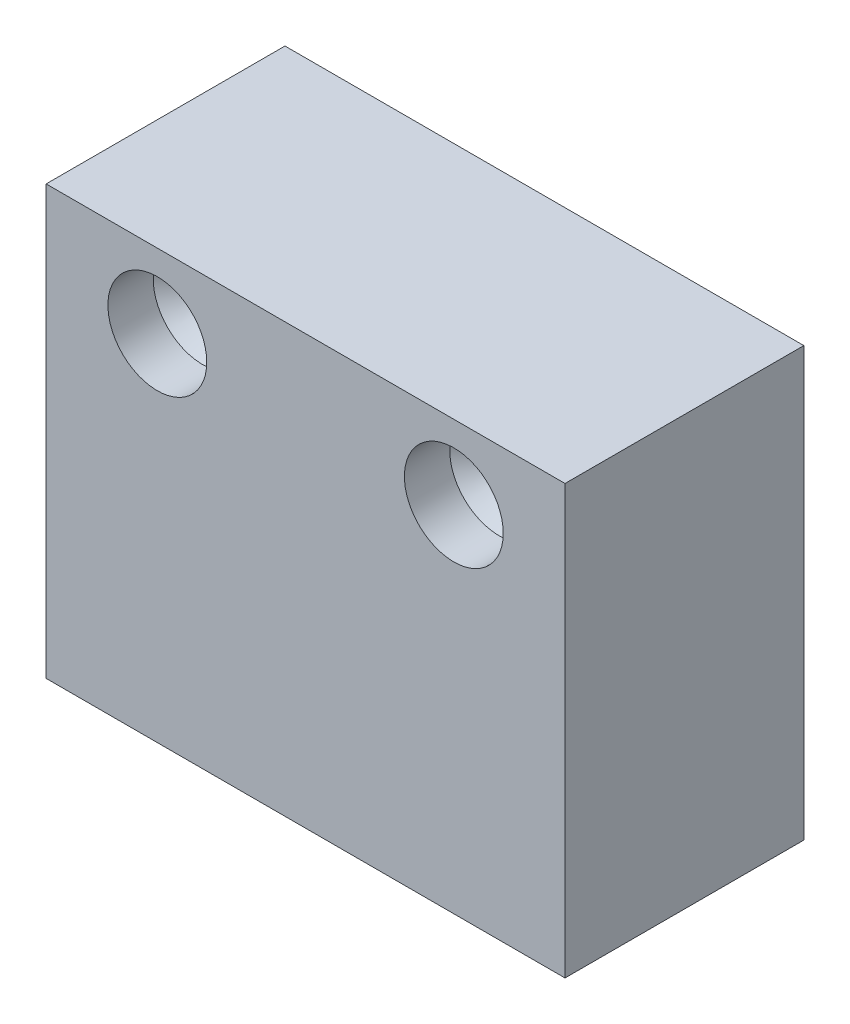
ISO-10303-21;
HEADER;
FILE_DESCRIPTION(('STEP AP214'),'2;1');
FILE_NAME('part.step','',(''),(''),'','','');
FILE_SCHEMA(('AUTOMOTIVE_DESIGN { 1 0 10303 214 1 1 1 1 }'));
ENDSEC;
DATA;
#1=APPLICATION_CONTEXT('core data for automotive mechanical design processes');
#2=APPLICATION_PROTOCOL_DEFINITION('international standard','automotive_design',2000,#1);
#3=PRODUCT_CONTEXT('',#1,'mechanical');
#4=PRODUCT('Part','Part','',(#3));
#5=PRODUCT_RELATED_PRODUCT_CATEGORY('part','',(#4));
#6=PRODUCT_DEFINITION_FORMATION('','',#4);
#7=PRODUCT_DEFINITION_CONTEXT('part definition',#1,'design');
#8=PRODUCT_DEFINITION('design','',#6,#7);
#9=PRODUCT_DEFINITION_SHAPE('','',#8);
#10=(LENGTH_UNIT() NAMED_UNIT(*) SI_UNIT(.MILLI.,.METRE.));
#11=(NAMED_UNIT(*) PLANE_ANGLE_UNIT() SI_UNIT($,.RADIAN.));
#12=(NAMED_UNIT(*) SI_UNIT($,.STERADIAN.) SOLID_ANGLE_UNIT());
#13=UNCERTAINTY_MEASURE_WITH_UNIT(LENGTH_MEASURE(1.E-05),#10,'distance_accuracy_value','');
#14=(GEOMETRIC_REPRESENTATION_CONTEXT(3) GLOBAL_UNCERTAINTY_ASSIGNED_CONTEXT((#13)) GLOBAL_UNIT_ASSIGNED_CONTEXT((#10,
#11,#12)) REPRESENTATION_CONTEXT('',''));
#15=CARTESIAN_POINT('',(0.,0.,0.));
#16=DIRECTION('',(0.,0.,1.));
#17=DIRECTION('',(1.,0.,0.));
#18=AXIS2_PLACEMENT_3D('',#15,#16,#17);
#19=CARTESIAN_POINT('',(42.1182761916576,-30.2295725482066,632.300025939941));
#20=DIRECTION('',(0.577350269189633,0.577350269189633,-0.577350269189612));
#21=DIRECTION('',(-0.707106781186535,0.,-0.70710678118656));
#22=AXIS2_PLACEMENT_3D('',#19,#20,#21);
#23=PLANE('',#22);
#24=DIRECTION('',(-0.707106781186548,0.707106781186548,0.));
#25=VECTOR('',#24,1.);
#26=CARTESIAN_POINT('',(42.8682761916576,-30.2295725482066,633.050025939941));
#27=LINE('',#26,#25);
#28=CARTESIAN_POINT('',(42.8682761916576,-30.2295725482066,633.050025939941));
#29=VERTEX_POINT('',#28);
#30=CARTESIAN_POINT('',(42.1182761916576,-29.4795725482066,633.050025939941));
#31=VERTEX_POINT('',#30);
#32=EDGE_CURVE('E34',#29,#31,#27,.T.);
#33=ORIENTED_EDGE('',*,*,#32,.F.);
#34=DIRECTION('',(0.707106781186535,0.,0.70710678118656));
#35=VECTOR('',#34,1.);
#36=CARTESIAN_POINT('',(42.1182761916576,-30.2295725482066,632.300025939941));
#37=LINE('',#36,#35);
#38=CARTESIAN_POINT('',(42.1182761916576,-30.2295725482066,632.300025939941));
#39=VERTEX_POINT('',#38);
#40=EDGE_CURVE('E318',#39,#29,#37,.T.);
#41=ORIENTED_EDGE('',*,*,#40,.F.);
#42=DIRECTION('',(0.,-0.707106781186535,-0.70710678118656));
#43=VECTOR('',#42,1.);
#44=CARTESIAN_POINT('',(42.1182761916576,-29.4795725482066,633.050025939941));
#45=LINE('',#44,#43);
#46=EDGE_CURVE('E263',#31,#39,#45,.T.);
#47=ORIENTED_EDGE('',*,*,#46,.F.);
#48=EDGE_LOOP('',(#33,#41,#47));
#49=FACE_BOUND('',#48,.T.);
#50=ADVANCED_FACE('F15',(#49),#23,.T.);
#51=CARTESIAN_POINT('',(42.8682761916576,-38.7295725482066,633.050025939941));
#52=DIRECTION('',(0.577350269189633,-0.577350269189633,-0.577350269189612));
#53=DIRECTION('',(-0.707106781186535,0.,-0.70710678118656));
#54=AXIS2_PLACEMENT_3D('',#51,#52,#53);
#55=PLANE('',#54);
#56=DIRECTION('',(0.,-0.707106781186535,0.70710678118656));
#57=VECTOR('',#56,1.);
#58=CARTESIAN_POINT('',(42.1182761916576,-38.7295725482066,632.300025939941));
#59=LINE('',#58,#57);
#60=CARTESIAN_POINT('',(42.1182761916576,-38.7295725482066,632.300025939941));
#61=VERTEX_POINT('',#60);
#62=CARTESIAN_POINT('',(42.1182761916576,-39.4795725482066,633.050025939941));
#63=VERTEX_POINT('',#62);
#64=EDGE_CURVE('E293',#61,#63,#59,.T.);
#65=ORIENTED_EDGE('',*,*,#64,.F.);
#66=DIRECTION('',(-0.707106781186535,0.,-0.70710678118656));
#67=VECTOR('',#66,1.);
#68=CARTESIAN_POINT('',(42.8682761916576,-38.7295725482066,633.050025939941));
#69=LINE('',#68,#67);
#70=CARTESIAN_POINT('',(42.8682761916576,-38.7295725482066,633.050025939941));
#71=VERTEX_POINT('',#70);
#72=EDGE_CURVE('E10',#71,#61,#69,.T.);
#73=ORIENTED_EDGE('',*,*,#72,.F.);
#74=DIRECTION('',(0.707106781186548,0.707106781186548,0.));
#75=VECTOR('',#74,1.);
#76=CARTESIAN_POINT('',(42.1182761916576,-39.4795725482066,633.050025939941));
#77=LINE('',#76,#75);
#78=EDGE_CURVE('E308',#63,#71,#77,.T.);
#79=ORIENTED_EDGE('',*,*,#78,.F.);
#80=EDGE_LOOP('',(#65,#73,#79));
#81=FACE_BOUND('',#80,.T.);
#82=ADVANCED_FACE('F378',(#81),#55,.T.);
#83=CARTESIAN_POINT('',(42.4932761916577,-34.4795725482066,632.675025939941));
#84=DIRECTION('',(0.70710678118656,0.,-0.707106781186535));
#85=DIRECTION('',(-0.707106781186535,0.,-0.70710678118656));
#86=AXIS2_PLACEMENT_3D('',#83,#84,#85);
#87=PLANE('',#86);
#88=ORIENTED_EDGE('',*,*,#72,.T.);
#89=DIRECTION('',(0.,1.,0.));
#90=VECTOR('',#89,1.);
#91=CARTESIAN_POINT('',(42.1182761916576,-34.4795725482066,632.300025939941));
#92=LINE('',#91,#90);
#93=EDGE_CURVE('E25',#61,#39,#92,.T.);
#94=ORIENTED_EDGE('',*,*,#93,.T.);
#95=ORIENTED_EDGE('',*,*,#40,.T.);
#96=DIRECTION('',(0.,-1.,0.));
#97=VECTOR('',#96,1.);
#98=CARTESIAN_POINT('',(42.8682761916576,-34.4795725482066,633.050025939941));
#99=LINE('',#98,#97);
#100=EDGE_CURVE('E315',#29,#71,#99,.T.);
#101=ORIENTED_EDGE('',*,*,#100,.T.);
#102=EDGE_LOOP('',(#88,#94,#95,#101));
#103=FACE_BOUND('',#102,.T.);
#104=ADVANCED_FACE('F349',(#103),#87,.T.);
#105=CARTESIAN_POINT('',(42.4932761916577,-39.1045725482066,633.550025939941));
#106=DIRECTION('',(0.707106781186548,-0.707106781186548,0.));
#107=DIRECTION('',(0.,0.,-1.));
#108=AXIS2_PLACEMENT_3D('',#105,#106,#107);
#109=PLANE('',#108);
#110=DIRECTION('',(-0.707106781186548,-0.707106781186548,0.));
#111=VECTOR('',#110,1.);
#112=CARTESIAN_POINT('',(45.180782301873,-36.4170664379913,634.80000782013));
#113=LINE('',#112,#111);
#114=CARTESIAN_POINT('',(42.8682761916576,-38.7295725482066,634.80000782013));
#115=VERTEX_POINT('',#114);
#116=CARTESIAN_POINT('',(42.1182761916576,-39.4795725482066,634.80000782013));
#117=VERTEX_POINT('',#116);
#118=EDGE_CURVE('E312',#115,#117,#113,.T.);
#119=ORIENTED_EDGE('',*,*,#118,.T.);
#120=DIRECTION('',(0.,0.,-1.));
#121=VECTOR('',#120,1.);
#122=CARTESIAN_POINT('',(42.1182761916576,-39.4795725482066,633.550025939941));
#123=LINE('',#122,#121);
#124=EDGE_CURVE('E309',#117,#63,#123,.T.);
#125=ORIENTED_EDGE('',*,*,#124,.T.);
#126=ORIENTED_EDGE('',*,*,#78,.T.);
#127=DIRECTION('',(0.,0.,1.));
#128=VECTOR('',#127,1.);
#129=CARTESIAN_POINT('',(42.8682761916576,-38.7295725482066,633.550025939941));
#130=LINE('',#129,#128);
#131=EDGE_CURVE('E301',#71,#115,#130,.T.);
#132=ORIENTED_EDGE('',*,*,#131,.T.);
#133=EDGE_LOOP('',(#119,#125,#126,#132));
#134=FACE_BOUND('',#133,.T.);
#135=ADVANCED_FACE('F388',(#134),#109,.T.);
#136=CARTESIAN_POINT('',(39.3682761916577,-30.2295725482066,633.050025939941));
#137=DIRECTION('',(-0.577350269189635,0.577350269189635,-0.577350269189608));
#138=DIRECTION('',(-0.70710678118653,0.,0.707106781186565));
#139=AXIS2_PLACEMENT_3D('',#136,#137,#138);
#140=PLANE('',#139);
#141=DIRECTION('',(0.,0.707106781186535,0.70710678118656));
#142=VECTOR('',#141,1.);
#143=CARTESIAN_POINT('',(40.1182761916576,-30.2295725482066,632.300025939941));
#144=LINE('',#143,#142);
#145=CARTESIAN_POINT('',(40.1182761916576,-30.2295725482066,632.300025939941));
#146=VERTEX_POINT('',#145);
#147=CARTESIAN_POINT('',(40.1182761916577,-29.4795725482066,633.050025939941));
#148=VERTEX_POINT('',#147);
#149=EDGE_CURVE('E259',#146,#148,#144,.T.);
#150=ORIENTED_EDGE('',*,*,#149,.F.);
#151=DIRECTION('',(0.707106781186531,0.,-0.707106781186564));
#152=VECTOR('',#151,1.);
#153=CARTESIAN_POINT('',(39.3682761916577,-30.2295725482066,633.050025939941));
#154=LINE('',#153,#152);
#155=CARTESIAN_POINT('',(39.3682761916577,-30.2295725482066,633.050025939941));
#156=VERTEX_POINT('',#155);
#157=EDGE_CURVE('E280',#156,#146,#154,.T.);
#158=ORIENTED_EDGE('',*,*,#157,.F.);
#159=DIRECTION('',(-0.707106781186548,-0.707106781186548,0.));
#160=VECTOR('',#159,1.);
#161=CARTESIAN_POINT('',(40.1182761916577,-29.4795725482066,633.050025939941));
#162=LINE('',#161,#160);
#163=EDGE_CURVE('E266',#148,#156,#162,.T.);
#164=ORIENTED_EDGE('',*,*,#163,.F.);
#165=EDGE_LOOP('',(#150,#158,#164));
#166=FACE_BOUND('',#165,.T.);
#167=ADVANCED_FACE('F362',(#166),#140,.T.);
#168=CARTESIAN_POINT('',(40.1182761916577,-39.4795725482066,633.050025939941));
#169=DIRECTION('',(-0.577350269189635,-0.577350269189635,-0.577350269189607));
#170=DIRECTION('',(-0.70710678118653,0.,0.707106781186565));
#171=AXIS2_PLACEMENT_3D('',#168,#169,#170);
#172=PLANE('',#171);
#173=DIRECTION('',(-0.707106781186531,0.,0.707106781186564));
#174=VECTOR('',#173,1.);
#175=CARTESIAN_POINT('',(40.1182761916576,-38.7295725482066,632.300025939941));
#176=LINE('',#175,#174);
#177=CARTESIAN_POINT('',(40.1182761916576,-38.7295725482066,632.300025939941));
#178=VERTEX_POINT('',#177);
#179=CARTESIAN_POINT('',(39.3682761916577,-38.7295725482066,633.050025939941));
#180=VERTEX_POINT('',#179);
#181=EDGE_CURVE('E276',#178,#180,#176,.T.);
#182=ORIENTED_EDGE('',*,*,#181,.F.);
#183=DIRECTION('',(0.,0.707106781186535,-0.70710678118656));
#184=VECTOR('',#183,1.);
#185=CARTESIAN_POINT('',(40.1182761916577,-39.4795725482066,633.050025939941));
#186=LINE('',#185,#184);
#187=CARTESIAN_POINT('',(40.1182761916577,-39.4795725482066,633.050025939941));
#188=VERTEX_POINT('',#187);
#189=EDGE_CURVE('E297',#188,#178,#186,.T.);
#190=ORIENTED_EDGE('',*,*,#189,.F.);
#191=DIRECTION('',(0.707106781186548,-0.707106781186548,0.));
#192=VECTOR('',#191,1.);
#193=CARTESIAN_POINT('',(39.3682761916577,-38.7295725482066,633.050025939941));
#194=LINE('',#193,#192);
#195=EDGE_CURVE('E283',#180,#188,#194,.T.);
#196=ORIENTED_EDGE('',*,*,#195,.F.);
#197=EDGE_LOOP('',(#182,#190,#196));
#198=FACE_BOUND('',#197,.T.);
#199=ADVANCED_FACE('F394',(#198),#172,.T.);
#200=CARTESIAN_POINT('',(41.1182761916576,-39.1045725482066,632.675025939941));
#201=DIRECTION('',(0.,-0.70710678118656,-0.707106781186535));
#202=DIRECTION('',(-1.,0.,0.));
#203=AXIS2_PLACEMENT_3D('',#200,#201,#202);
#204=PLANE('',#203);
#205=ORIENTED_EDGE('',*,*,#189,.T.);
#206=DIRECTION('',(1.,0.,0.));
#207=VECTOR('',#206,1.);
#208=CARTESIAN_POINT('',(41.1182761916576,-38.7295725482066,632.300025939941));
#209=LINE('',#208,#207);
#210=EDGE_CURVE('E294',#178,#61,#209,.T.);
#211=ORIENTED_EDGE('',*,*,#210,.T.);
#212=ORIENTED_EDGE('',*,*,#64,.T.);
#213=DIRECTION('',(-1.,0.,0.));
#214=VECTOR('',#213,1.);
#215=CARTESIAN_POINT('',(41.1182761916576,-39.4795725482066,633.050025939941));
#216=LINE('',#215,#214);
#217=EDGE_CURVE('E290',#63,#188,#216,.T.);
#218=ORIENTED_EDGE('',*,*,#217,.T.);
#219=EDGE_LOOP('',(#205,#211,#212,#218));
#220=FACE_BOUND('',#219,.T.);
#221=ADVANCED_FACE('F397',(#220),#204,.T.);
#222=CARTESIAN_POINT('',(39.7432761916577,-39.1045725482066,633.550025939941));
#223=DIRECTION('',(-0.707106781186548,-0.707106781186548,0.));
#224=DIRECTION('',(0.,0.,1.));
#225=AXIS2_PLACEMENT_3D('',#222,#223,#224);
#226=PLANE('',#225);
#227=DIRECTION('',(-0.707106781186548,0.707106781186548,0.));
#228=VECTOR('',#227,1.);
#229=CARTESIAN_POINT('',(40.805782301873,-40.1670786584219,634.80000782013));
#230=LINE('',#229,#228);
#231=CARTESIAN_POINT('',(40.1182761916577,-39.4795725482066,634.80000782013));
#232=VERTEX_POINT('',#231);
#233=CARTESIAN_POINT('',(39.3682761916577,-38.7295725482066,634.80000782013));
#234=VERTEX_POINT('',#233);
#235=EDGE_CURVE('E287',#232,#234,#230,.T.);
#236=ORIENTED_EDGE('',*,*,#235,.T.);
#237=DIRECTION('',(0.,0.,-1.));
#238=VECTOR('',#237,1.);
#239=CARTESIAN_POINT('',(39.3682761916577,-38.7295725482066,633.550025939941));
#240=LINE('',#239,#238);
#241=EDGE_CURVE('E284',#234,#180,#240,.T.);
#242=ORIENTED_EDGE('',*,*,#241,.T.);
#243=ORIENTED_EDGE('',*,*,#195,.T.);
#244=DIRECTION('',(0.,0.,1.));
#245=VECTOR('',#244,1.);
#246=CARTESIAN_POINT('',(40.1182761916577,-39.4795725482066,633.550025939941));
#247=LINE('',#246,#245);
#248=EDGE_CURVE('E281',#188,#232,#247,.T.);
#249=ORIENTED_EDGE('',*,*,#248,.T.);
#250=EDGE_LOOP('',(#236,#242,#243,#249));
#251=FACE_BOUND('',#250,.T.);
#252=ADVANCED_FACE('F375',(#251),#226,.T.);
#253=CARTESIAN_POINT('',(39.7432761916576,-34.4795725482066,632.675025939941));
#254=DIRECTION('',(-0.707106781186564,0.,-0.707106781186531));
#255=DIRECTION('',(-0.707106781186531,0.,0.707106781186564));
#256=AXIS2_PLACEMENT_3D('',#253,#254,#255);
#257=PLANE('',#256);
#258=ORIENTED_EDGE('',*,*,#157,.T.);
#259=DIRECTION('',(0.,-1.,0.));
#260=VECTOR('',#259,1.);
#261=CARTESIAN_POINT('',(40.1182761916576,-34.4795725482066,632.300025939941));
#262=LINE('',#261,#260);
#263=EDGE_CURVE('E277',#146,#178,#262,.T.);
#264=ORIENTED_EDGE('',*,*,#263,.T.);
#265=ORIENTED_EDGE('',*,*,#181,.T.);
#266=DIRECTION('',(0.,1.,0.));
#267=VECTOR('',#266,1.);
#268=CARTESIAN_POINT('',(39.3682761916577,-34.4795725482066,633.050025939941));
#269=LINE('',#268,#267);
#270=EDGE_CURVE('E273',#180,#156,#269,.T.);
#271=ORIENTED_EDGE('',*,*,#270,.T.);
#272=EDGE_LOOP('',(#258,#264,#265,#271));
#273=FACE_BOUND('',#272,.T.);
#274=ADVANCED_FACE('F358',(#273),#257,.T.);
#275=CARTESIAN_POINT('',(39.7432761916577,-29.8545725482066,633.550025939941));
#276=DIRECTION('',(-0.707106781186548,0.707106781186548,0.));
#277=DIRECTION('',(0.,0.,1.));
#278=AXIS2_PLACEMENT_3D('',#275,#276,#277);
#279=PLANE('',#278);
#280=DIRECTION('',(0.707106781186548,0.707106781186548,0.));
#281=VECTOR('',#280,1.);
#282=CARTESIAN_POINT('',(40.805782301873,-28.7920664379913,634.80000782013));
#283=LINE('',#282,#281);
#284=CARTESIAN_POINT('',(39.3682761916577,-30.2295725482066,634.80000782013));
#285=VERTEX_POINT('',#284);
#286=CARTESIAN_POINT('',(40.1182761916577,-29.4795725482066,634.80000782013));
#287=VERTEX_POINT('',#286);
#288=EDGE_CURVE('E270',#285,#287,#283,.T.);
#289=ORIENTED_EDGE('',*,*,#288,.T.);
#290=DIRECTION('',(0.,0.,-1.));
#291=VECTOR('',#290,1.);
#292=CARTESIAN_POINT('',(40.1182761916577,-29.4795725482066,633.550025939941));
#293=LINE('',#292,#291);
#294=EDGE_CURVE('E267',#287,#148,#293,.T.);
#295=ORIENTED_EDGE('',*,*,#294,.T.);
#296=ORIENTED_EDGE('',*,*,#163,.T.);
#297=DIRECTION('',(0.,0.,1.));
#298=VECTOR('',#297,1.);
#299=CARTESIAN_POINT('',(39.3682761916577,-30.2295725482066,633.550025939941));
#300=LINE('',#299,#298);
#301=EDGE_CURVE('E264',#156,#285,#300,.T.);
#302=ORIENTED_EDGE('',*,*,#301,.T.);
#303=EDGE_LOOP('',(#289,#295,#296,#302));
#304=FACE_BOUND('',#303,.T.);
#305=ADVANCED_FACE('F366',(#304),#279,.T.);
#306=CARTESIAN_POINT('',(41.1182761916576,-29.8545725482066,632.675025939941));
#307=DIRECTION('',(0.,0.70710678118656,-0.707106781186535));
#308=DIRECTION('',(-1.,0.,0.));
#309=AXIS2_PLACEMENT_3D('',#306,#307,#308);
#310=PLANE('',#309);
#311=ORIENTED_EDGE('',*,*,#46,.T.);
#312=DIRECTION('',(-1.,0.,0.));
#313=VECTOR('',#312,1.);
#314=CARTESIAN_POINT('',(41.1182761916576,-30.2295725482066,632.300025939941));
#315=LINE('',#314,#313);
#316=EDGE_CURVE('E260',#39,#146,#315,.T.);
#317=ORIENTED_EDGE('',*,*,#316,.T.);
#318=ORIENTED_EDGE('',*,*,#149,.T.);
#319=DIRECTION('',(1.,0.,0.));
#320=VECTOR('',#319,1.);
#321=CARTESIAN_POINT('',(41.1182761916576,-29.4795725482066,633.050025939941));
#322=LINE('',#321,#320);
#323=EDGE_CURVE('E256',#148,#31,#322,.T.);
#324=ORIENTED_EDGE('',*,*,#323,.T.);
#325=EDGE_LOOP('',(#311,#317,#318,#324));
#326=FACE_BOUND('',#325,.T.);
#327=ADVANCED_FACE('F332',(#326),#310,.T.);
#328=CARTESIAN_POINT('',(42.4932761916577,-29.8545725482066,633.550025939941));
#329=DIRECTION('',(0.707106781186548,0.707106781186548,0.));
#330=DIRECTION('',(0.,0.,-1.));
#331=AXIS2_PLACEMENT_3D('',#328,#329,#330);
#332=PLANE('',#331);
#333=DIRECTION('',(0.707106781186548,-0.707106781186548,0.));
#334=VECTOR('',#333,1.);
#335=CARTESIAN_POINT('',(45.180782301873,-32.5420786584219,634.80000782013));
#336=LINE('',#335,#334);
#337=CARTESIAN_POINT('',(42.1182761916576,-29.4795725482066,634.80000782013));
#338=VERTEX_POINT('',#337);
#339=CARTESIAN_POINT('',(42.8682761916576,-30.2295725482066,634.80000782013));
#340=VERTEX_POINT('',#339);
#341=EDGE_CURVE('E253',#338,#340,#336,.T.);
#342=ORIENTED_EDGE('',*,*,#341,.T.);
#343=DIRECTION('',(0.,0.,-1.));
#344=VECTOR('',#343,1.);
#345=CARTESIAN_POINT('',(42.8682761916576,-30.2295725482066,633.550025939941));
#346=LINE('',#345,#344);
#347=EDGE_CURVE('E250',#340,#29,#346,.T.);
#348=ORIENTED_EDGE('',*,*,#347,.T.);
#349=ORIENTED_EDGE('',*,*,#32,.T.);
#350=DIRECTION('',(0.,0.,1.));
#351=VECTOR('',#350,1.);
#352=CARTESIAN_POINT('',(42.1182761916576,-29.4795725482066,633.550025939941));
#353=LINE('',#352,#351);
#354=EDGE_CURVE('E235',#31,#338,#353,.T.);
#355=ORIENTED_EDGE('',*,*,#354,.T.);
#356=EDGE_LOOP('',(#342,#348,#349,#355));
#357=FACE_BOUND('',#356,.T.);
#358=ADVANCED_FACE('F327',(#357),#332,.T.);
#359=CARTESIAN_POINT('',(41.1182761916576,-39.4795725482066,633.550025939941));
#360=DIRECTION('',(0.,1.,0.));
#361=DIRECTION('',(0.,0.,1.));
#362=AXIS2_PLACEMENT_3D('',#359,#360,#361);
#363=PLANE('',#362);
#364=ORIENTED_EDGE('',*,*,#248,.F.);
#365=ORIENTED_EDGE('',*,*,#217,.F.);
#366=ORIENTED_EDGE('',*,*,#124,.F.);
#367=DIRECTION('',(1.,0.,0.));
#368=VECTOR('',#367,1.);
#369=CARTESIAN_POINT('',(44.8682884120883,-39.4795725482066,634.80000782013));
#370=LINE('',#369,#368);
#371=EDGE_CURVE('E244',#232,#117,#370,.T.);
#372=ORIENTED_EDGE('',*,*,#371,.F.);
#373=EDGE_LOOP('',(#364,#365,#366,#372));
#374=FACE_BOUND('',#373,.T.);
#375=ADVANCED_FACE('F410',(#374),#363,.F.);
#376=CARTESIAN_POINT('',(42.8682761916576,-34.4795725482066,633.550025939941));
#377=DIRECTION('',(-1.,0.,0.));
#378=DIRECTION('',(0.,0.,-1.));
#379=AXIS2_PLACEMENT_3D('',#376,#377,#378);
#380=PLANE('',#379);
#381=ORIENTED_EDGE('',*,*,#131,.F.);
#382=ORIENTED_EDGE('',*,*,#100,.F.);
#383=ORIENTED_EDGE('',*,*,#347,.F.);
#384=DIRECTION('',(0.,1.,0.));
#385=VECTOR('',#384,1.);
#386=CARTESIAN_POINT('',(42.8682761916576,-34.4795725482066,634.80000782013));
#387=LINE('',#386,#385);
#388=EDGE_CURVE('E212',#115,#340,#387,.T.);
#389=ORIENTED_EDGE('',*,*,#388,.F.);
#390=EDGE_LOOP('',(#381,#382,#383,#389));
#391=FACE_BOUND('',#390,.T.);
#392=ADVANCED_FACE('F346',(#391),#380,.F.);
#393=CARTESIAN_POINT('',(41.1182761916576,-34.4795725482066,632.300025939941));
#394=DIRECTION('',(0.,0.,-1.));
#395=DIRECTION('',(1.,0.,0.));
#396=AXIS2_PLACEMENT_3D('',#393,#394,#395);
#397=PLANE('',#396);
#398=ORIENTED_EDGE('',*,*,#93,.F.);
#399=ORIENTED_EDGE('',*,*,#210,.F.);
#400=ORIENTED_EDGE('',*,*,#263,.F.);
#401=ORIENTED_EDGE('',*,*,#316,.F.);
#402=EDGE_LOOP('',(#398,#399,#400,#401));
#403=FACE_BOUND('',#402,.T.);
#404=ADVANCED_FACE('F355',(#403),#397,.T.);
#405=CARTESIAN_POINT('',(39.3682761916577,-34.4795725482066,633.550025939941));
#406=DIRECTION('',(1.,0.,0.));
#407=DIRECTION('',(0.,0.,1.));
#408=AXIS2_PLACEMENT_3D('',#405,#406,#407);
#409=PLANE('',#408);
#410=ORIENTED_EDGE('',*,*,#241,.F.);
#411=DIRECTION('',(0.,-1.,0.));
#412=VECTOR('',#411,1.);
#413=CARTESIAN_POINT('',(39.3682761916577,-34.4795725482066,634.80000782013));
#414=LINE('',#413,#412);
#415=EDGE_CURVE('E241',#285,#234,#414,.T.);
#416=ORIENTED_EDGE('',*,*,#415,.F.);
#417=ORIENTED_EDGE('',*,*,#301,.F.);
#418=ORIENTED_EDGE('',*,*,#270,.F.);
#419=EDGE_LOOP('',(#410,#416,#417,#418));
#420=FACE_BOUND('',#419,.T.);
#421=ADVANCED_FACE('F364',(#420),#409,.F.);
#422=CARTESIAN_POINT('',(41.1182761916576,-29.4795725482066,633.550025939941));
#423=DIRECTION('',(0.,-1.,0.));
#424=DIRECTION('',(0.,0.,-1.));
#425=AXIS2_PLACEMENT_3D('',#422,#423,#424);
#426=PLANE('',#425);
#427=ORIENTED_EDGE('',*,*,#294,.F.);
#428=DIRECTION('',(-1.,0.,0.));
#429=VECTOR('',#428,1.);
#430=CARTESIAN_POINT('',(44.8682884120883,-29.4795725482066,634.80000782013));
#431=LINE('',#430,#429);
#432=EDGE_CURVE('E238',#338,#287,#431,.T.);
#433=ORIENTED_EDGE('',*,*,#432,.F.);
#434=ORIENTED_EDGE('',*,*,#354,.F.);
#435=ORIENTED_EDGE('',*,*,#323,.F.);
#436=EDGE_LOOP('',(#427,#433,#434,#435));
#437=FACE_BOUND('',#436,.T.);
#438=ADVANCED_FACE('F336',(#437),#426,.F.);
#439=CARTESIAN_POINT('',(45.368283821052,-22.9795725482065,636.425015449524));
#440=DIRECTION('',(0.,0.,1.));
#441=DIRECTION('',(1.,0.,0.));
#442=AXIS2_PLACEMENT_3D('',#439,#440,#441);
#443=CONICAL_SURFACE('',#442,2.375,0.785398163397448);
#444=CARTESIAN_POINT('',(45.368283821052,-22.9795725482066,635.800015449524));
#445=DIRECTION('',(0.,0.,1.));
#446=DIRECTION('',(0.,-1.,0.));
#447=AXIS2_PLACEMENT_3D('',#444,#445,#446);
#448=CIRCLE('',#447,1.75);
#449=CARTESIAN_POINT('',(45.368283821052,-24.7295725482066,635.800015449524));
#450=VERTEX_POINT('',#449);
#451=EDGE_CURVE('E230',#450,#450,#448,.T.);
#452=ORIENTED_EDGE('',*,*,#451,.F.);
#453=EDGE_LOOP('',(#452));
#454=FACE_BOUND('',#453,.T.);
#455=CARTESIAN_POINT('',(45.368283821052,-22.9795725482065,637.050015449524));
#456=DIRECTION('',(0.,0.,1.));
#457=DIRECTION('',(1.,0.,0.));
#458=AXIS2_PLACEMENT_3D('',#455,#456,#457);
#459=CIRCLE('',#458,3.);
#460=CARTESIAN_POINT('',(48.368283821052,-22.9795725482065,637.050015449524));
#461=VERTEX_POINT('',#460);
#462=EDGE_CURVE('E226',#461,#461,#459,.T.);
#463=ORIENTED_EDGE('',*,*,#462,.T.);
#464=EDGE_LOOP('',(#463));
#465=FACE_BOUND('',#464,.T.);
#466=ADVANCED_FACE('F430',(#454,#465),#443,.F.);
#467=CARTESIAN_POINT('',(45.368283821052,-22.9795725482065,651.800033569336));
#468=DIRECTION('',(0.,0.,-1.));
#469=DIRECTION('',(1.,0.,0.));
#470=AXIS2_PLACEMENT_3D('',#467,#468,#469);
#471=CYLINDRICAL_SURFACE('',#470,3.);
#472=CARTESIAN_POINT('',(45.368283821052,-22.9795725482065,639.800000190735));
#473=DIRECTION('',(0.,0.,-1.));
#474=DIRECTION('',(1.,0.,0.));
#475=AXIS2_PLACEMENT_3D('',#472,#473,#474);
#476=CIRCLE('',#475,3.);
#477=CARTESIAN_POINT('',(48.368283821052,-22.9795725482065,639.800000190735));
#478=VERTEX_POINT('',#477);
#479=EDGE_CURVE('E191',#478,#478,#476,.T.);
#480=ORIENTED_EDGE('',*,*,#479,.F.);
#481=EDGE_LOOP('',(#480));
#482=FACE_BOUND('',#481,.T.);
#483=ORIENTED_EDGE('',*,*,#462,.F.);
#484=EDGE_LOOP('',(#483));
#485=FACE_BOUND('',#484,.T.);
#486=ADVANCED_FACE('F433',(#482,#485),#471,.F.);
#487=CARTESIAN_POINT('',(63.3682838210521,-22.9795725482066,636.425000190735));
#488=DIRECTION('',(0.,0.,1.));
#489=DIRECTION('',(1.,0.,0.));
#490=AXIS2_PLACEMENT_3D('',#487,#488,#489);
#491=CONICAL_SURFACE('',#490,2.375,0.785398163397448);
#492=CARTESIAN_POINT('',(63.3682838210521,-22.9795725482066,635.800000190735));
#493=DIRECTION('',(0.,0.,1.));
#494=DIRECTION('',(0.,-1.,0.));
#495=AXIS2_PLACEMENT_3D('',#492,#493,#494);
#496=CIRCLE('',#495,1.75);
#497=CARTESIAN_POINT('',(63.3682838210521,-24.7295725482066,635.800000190735));
#498=VERTEX_POINT('',#497);
#499=EDGE_CURVE('E227',#498,#498,#496,.T.);
#500=ORIENTED_EDGE('',*,*,#499,.F.);
#501=EDGE_LOOP('',(#500));
#502=FACE_BOUND('',#501,.T.);
#503=CARTESIAN_POINT('',(63.3682838210521,-22.9795725482066,637.050000190735));
#504=DIRECTION('',(0.,0.,1.));
#505=DIRECTION('',(1.,0.,0.));
#506=AXIS2_PLACEMENT_3D('',#503,#504,#505);
#507=CIRCLE('',#506,3.);
#508=CARTESIAN_POINT('',(66.3682838210521,-22.9795725482066,637.050000190735));
#509=VERTEX_POINT('',#508);
#510=EDGE_CURVE('E223',#509,#509,#507,.T.);
#511=ORIENTED_EDGE('',*,*,#510,.T.);
#512=EDGE_LOOP('',(#511));
#513=FACE_BOUND('',#512,.T.);
#514=ADVANCED_FACE('F437',(#502,#513),#491,.F.);
#515=CARTESIAN_POINT('',(63.3682838210521,-22.9795725482066,651.800018310547));
#516=DIRECTION('',(0.,0.,1.));
#517=DIRECTION('',(1.,0.,0.));
#518=AXIS2_PLACEMENT_3D('',#515,#516,#517);
#519=CYLINDRICAL_SURFACE('',#518,3.);
#520=CARTESIAN_POINT('',(63.3682838210521,-22.9795725482066,639.800000190735));
#521=DIRECTION('',(0.,0.,-1.));
#522=DIRECTION('',(1.,0.,0.));
#523=AXIS2_PLACEMENT_3D('',#520,#521,#522);
#524=CIRCLE('',#523,3.);
#525=CARTESIAN_POINT('',(66.3682838210521,-22.9795725482066,639.800000190735));
#526=VERTEX_POINT('',#525);
#527=EDGE_CURVE('E168',#526,#526,#524,.T.);
#528=ORIENTED_EDGE('',*,*,#527,.F.);
#529=EDGE_LOOP('',(#528));
#530=FACE_BOUND('',#529,.T.);
#531=ORIENTED_EDGE('',*,*,#510,.F.);
#532=EDGE_LOOP('',(#531));
#533=FACE_BOUND('',#532,.T.);
#534=ADVANCED_FACE('F441',(#530,#533),#519,.F.);
#535=CARTESIAN_POINT('',(63.3682838210521,-22.9795725482066,632.800000190735));
#536=DIRECTION('',(0.,0.,1.));
#537=DIRECTION('',(0.,-1.,0.));
#538=AXIS2_PLACEMENT_3D('',#535,#536,#537);
#539=CYLINDRICAL_SURFACE('',#538,1.75);
#540=ORIENTED_EDGE('',*,*,#499,.T.);
#541=EDGE_LOOP('',(#540));
#542=FACE_BOUND('',#541,.T.);
#543=CARTESIAN_POINT('',(63.3682838210521,-22.9795725482066,625.300000190735));
#544=DIRECTION('',(0.,0.,1.));
#545=DIRECTION('',(0.,-1.,0.));
#546=AXIS2_PLACEMENT_3D('',#543,#544,#545);
#547=CIRCLE('',#546,1.75);
#548=CARTESIAN_POINT('',(63.3682838210521,-24.7295725482066,625.300000190735));
#549=VERTEX_POINT('',#548);
#550=EDGE_CURVE('E184',#549,#549,#547,.T.);
#551=ORIENTED_EDGE('',*,*,#550,.F.);
#552=EDGE_LOOP('',(#551));
#553=FACE_BOUND('',#552,.T.);
#554=ADVANCED_FACE('F445',(#542,#553),#539,.F.);
#555=CARTESIAN_POINT('',(45.368283821052,-22.9795725482066,632.800000190735));
#556=DIRECTION('',(0.,0.,1.));
#557=DIRECTION('',(0.,-1.,0.));
#558=AXIS2_PLACEMENT_3D('',#555,#556,#557);
#559=CYLINDRICAL_SURFACE('',#558,1.75);
#560=ORIENTED_EDGE('',*,*,#451,.T.);
#561=EDGE_LOOP('',(#560));
#562=FACE_BOUND('',#561,.T.);
#563=CARTESIAN_POINT('',(45.368283821052,-22.9795725482066,625.300000190735));
#564=DIRECTION('',(0.,0.,1.));
#565=DIRECTION('',(0.,-1.,0.));
#566=AXIS2_PLACEMENT_3D('',#563,#564,#565);
#567=CIRCLE('',#566,1.75);
#568=CARTESIAN_POINT('',(45.368283821052,-24.7295725482066,625.300000190735));
#569=VERTEX_POINT('',#568);
#570=EDGE_CURVE('E198',#569,#569,#567,.T.);
#571=ORIENTED_EDGE('',*,*,#570,.F.);
#572=EDGE_LOOP('',(#571));
#573=FACE_BOUND('',#572,.T.);
#574=ADVANCED_FACE('F449',(#562,#573),#559,.F.);
#575=CARTESIAN_POINT('',(48.6183006325189,-34.4795725482065,634.80000782013));
#576=DIRECTION('',(0.,0.,1.));
#577=DIRECTION('',(0.,1.,0.));
#578=AXIS2_PLACEMENT_3D('',#575,#576,#577);
#579=PLANE('',#578);
#580=ORIENTED_EDGE('',*,*,#432,.T.);
#581=ORIENTED_EDGE('',*,*,#288,.F.);
#582=ORIENTED_EDGE('',*,*,#415,.T.);
#583=ORIENTED_EDGE('',*,*,#235,.F.);
#584=ORIENTED_EDGE('',*,*,#371,.T.);
#585=ORIENTED_EDGE('',*,*,#118,.F.);
#586=ORIENTED_EDGE('',*,*,#388,.T.);
#587=ORIENTED_EDGE('',*,*,#341,.F.);
#588=EDGE_LOOP('',(#580,#581,#582,#583,#584,#585,#586,#587));
#589=FACE_BOUND('',#588,.T.);
#590=DIRECTION('',(0.,-1.,0.));
#591=VECTOR('',#590,1.);
#592=CARTESIAN_POINT('',(38.6182761916576,-34.4795725482066,634.80000782013));
#593=LINE('',#592,#591);
#594=CARTESIAN_POINT('',(38.6182761916576,-26.4795725482065,634.80000782013));
#595=VERTEX_POINT('',#594);
#596=CARTESIAN_POINT('',(38.6182761916576,-42.4795725482066,634.80000782013));
#597=VERTEX_POINT('',#596);
#598=EDGE_CURVE('E201',#595,#597,#593,.T.);
#599=ORIENTED_EDGE('',*,*,#598,.F.);
#600=DIRECTION('',(-1.,0.,0.));
#601=VECTOR('',#600,1.);
#602=CARTESIAN_POINT('',(51.1183006325189,-26.4795725482065,634.80000782013));
#603=LINE('',#602,#601);
#604=CARTESIAN_POINT('',(68.618300632519,-26.4795725482065,634.80000782013));
#605=VERTEX_POINT('',#604);
#606=EDGE_CURVE('E207',#605,#595,#603,.T.);
#607=ORIENTED_EDGE('',*,*,#606,.F.);
#608=DIRECTION('',(0.,1.,0.));
#609=VECTOR('',#608,1.);
#610=CARTESIAN_POINT('',(68.618300632519,-34.4795725482065,634.80000782013));
#611=LINE('',#610,#609);
#612=CARTESIAN_POINT('',(68.618300632519,-42.4795725482066,634.80000782013));
#613=VERTEX_POINT('',#612);
#614=EDGE_CURVE('E195',#613,#605,#611,.T.);
#615=ORIENTED_EDGE('',*,*,#614,.F.);
#616=DIRECTION('',(1.,0.,0.));
#617=VECTOR('',#616,1.);
#618=CARTESIAN_POINT('',(51.1183006325189,-42.4795725482066,634.80000782013));
#619=LINE('',#618,#617);
#620=EDGE_CURVE('E206',#597,#613,#619,.T.);
#621=ORIENTED_EDGE('',*,*,#620,.F.);
#622=EDGE_LOOP('',(#599,#607,#615,#621));
#623=FACE_BOUND('',#622,.T.);
#624=ADVANCED_FACE('F339',(#589,#623),#579,.F.);
#625=CARTESIAN_POINT('',(53.618300632519,-42.4795725482066,629.300000190735));
#626=DIRECTION('',(0.,1.,0.));
#627=DIRECTION('',(0.,0.,-1.));
#628=AXIS2_PLACEMENT_3D('',#625,#626,#627);
#629=PLANE('',#628);
#630=DIRECTION('',(0.,0.,-1.));
#631=VECTOR('',#630,1.);
#632=CARTESIAN_POINT('',(38.6182761916576,-42.4795725482066,631.050000190735));
#633=LINE('',#632,#631);
#634=CARTESIAN_POINT('',(38.6182761916578,-42.4795725482066,625.300000190735));
#635=VERTEX_POINT('',#634);
#636=EDGE_CURVE('E183',#597,#635,#633,.T.);
#637=ORIENTED_EDGE('',*,*,#636,.F.);
#638=ORIENTED_EDGE('',*,*,#620,.T.);
#639=DIRECTION('',(0.,0.,-1.));
#640=VECTOR('',#639,1.);
#641=CARTESIAN_POINT('',(68.618300632519,-42.4795725482066,629.300000190735));
#642=LINE('',#641,#640);
#643=CARTESIAN_POINT('',(68.6183006325191,-42.4795725482066,625.300000190735));
#644=VERTEX_POINT('',#643);
#645=EDGE_CURVE('E203',#613,#644,#642,.T.);
#646=ORIENTED_EDGE('',*,*,#645,.T.);
#647=DIRECTION('',(1.,0.,0.));
#648=VECTOR('',#647,1.);
#649=CARTESIAN_POINT('',(51.9406722927035,-42.4795725482066,625.300000190735));
#650=LINE('',#649,#648);
#651=EDGE_CURVE('E187',#635,#644,#650,.T.);
#652=ORIENTED_EDGE('',*,*,#651,.F.);
#653=EDGE_LOOP('',(#637,#638,#646,#652));
#654=FACE_BOUND('',#653,.T.);
#655=ADVANCED_FACE('F456',(#654),#629,.T.);
#656=CARTESIAN_POINT('',(53.618300632519,-26.4795725482065,629.300000190735));
#657=DIRECTION('',(0.,-1.,0.));
#658=DIRECTION('',(0.,0.,1.));
#659=AXIS2_PLACEMENT_3D('',#656,#657,#658);
#660=PLANE('',#659);
#661=DIRECTION('',(0.,0.,1.));
#662=VECTOR('',#661,1.);
#663=CARTESIAN_POINT('',(38.6182761916576,-26.4795725482065,631.050000190735));
#664=LINE('',#663,#662);
#665=CARTESIAN_POINT('',(38.6182761916578,-26.4795725482065,625.300000190735));
#666=VERTEX_POINT('',#665);
#667=EDGE_CURVE('E196',#666,#595,#664,.T.);
#668=ORIENTED_EDGE('',*,*,#667,.F.);
#669=DIRECTION('',(-1.,0.,0.));
#670=VECTOR('',#669,1.);
#671=CARTESIAN_POINT('',(51.9406722927035,-26.4795725482065,625.300000190735));
#672=LINE('',#671,#670);
#673=CARTESIAN_POINT('',(68.6183006325191,-26.4795725482065,625.300000190735));
#674=VERTEX_POINT('',#673);
#675=EDGE_CURVE('E178',#674,#666,#672,.T.);
#676=ORIENTED_EDGE('',*,*,#675,.F.);
#677=DIRECTION('',(0.,0.,-1.));
#678=VECTOR('',#677,1.);
#679=CARTESIAN_POINT('',(68.618300632519,-26.4795725482065,629.300000190735));
#680=LINE('',#679,#678);
#681=EDGE_CURVE('E192',#605,#674,#680,.T.);
#682=ORIENTED_EDGE('',*,*,#681,.F.);
#683=ORIENTED_EDGE('',*,*,#606,.T.);
#684=EDGE_LOOP('',(#668,#676,#682,#683));
#685=FACE_BOUND('',#684,.T.);
#686=ADVANCED_FACE('F459',(#685),#660,.T.);
#687=CARTESIAN_POINT('',(68.618300632519,-34.4795725482065,629.300000190735));
#688=DIRECTION('',(-1.,0.,0.));
#689=DIRECTION('',(0.,0.,-1.));
#690=AXIS2_PLACEMENT_3D('',#687,#688,#689);
#691=PLANE('',#690);
#692=ORIENTED_EDGE('',*,*,#645,.F.);
#693=ORIENTED_EDGE('',*,*,#614,.T.);
#694=ORIENTED_EDGE('',*,*,#681,.T.);
#695=DIRECTION('',(0.,1.,0.));
#696=VECTOR('',#695,1.);
#697=CARTESIAN_POINT('',(68.6183006325191,-34.4795725482065,625.300000190735));
#698=LINE('',#697,#696);
#699=EDGE_CURVE('E188',#644,#674,#698,.T.);
#700=ORIENTED_EDGE('',*,*,#699,.F.);
#701=EDGE_LOOP('',(#692,#693,#694,#700));
#702=FACE_BOUND('',#701,.T.);
#703=ADVANCED_FACE('F463',(#702),#691,.T.);
#704=CARTESIAN_POINT('',(38.6182761916576,-34.4795725482066,632.800000190735));
#705=DIRECTION('',(1.,0.,0.));
#706=DIRECTION('',(0.,0.,1.));
#707=AXIS2_PLACEMENT_3D('',#704,#705,#706);
#708=PLANE('',#707);
#709=ORIENTED_EDGE('',*,*,#667,.T.);
#710=ORIENTED_EDGE('',*,*,#598,.T.);
#711=ORIENTED_EDGE('',*,*,#636,.T.);
#712=DIRECTION('',(0.,1.,0.));
#713=VECTOR('',#712,1.);
#714=CARTESIAN_POINT('',(38.6182761916578,-34.4795725482066,625.300000190735));
#715=LINE('',#714,#713);
#716=CARTESIAN_POINT('',(38.6182761916578,-44.4795725482066,625.300000190735));
#717=VERTEX_POINT('',#716);
#718=EDGE_CURVE('E172',#717,#635,#715,.T.);
#719=ORIENTED_EDGE('',*,*,#718,.F.);
#720=DIRECTION('',(0.,0.,1.));
#721=VECTOR('',#720,1.);
#722=CARTESIAN_POINT('',(38.6182761916576,-44.4795725482066,632.800000190735));
#723=LINE('',#722,#721);
#724=CARTESIAN_POINT('',(38.6182761916576,-44.4795725482066,639.800000190735));
#725=VERTEX_POINT('',#724);
#726=EDGE_CURVE('E180',#717,#725,#723,.T.);
#727=ORIENTED_EDGE('',*,*,#726,.T.);
#728=DIRECTION('',(0.,-1.,0.));
#729=VECTOR('',#728,1.);
#730=CARTESIAN_POINT('',(38.6182761916576,-34.4795725482066,639.800000190735));
#731=LINE('',#730,#729);
#732=CARTESIAN_POINT('',(38.6182761916576,-18.4795725482065,639.800000190735));
#733=VERTEX_POINT('',#732);
#734=EDGE_CURVE('E152',#733,#725,#731,.T.);
#735=ORIENTED_EDGE('',*,*,#734,.F.);
#736=DIRECTION('',(0.,0.,1.));
#737=VECTOR('',#736,1.);
#738=CARTESIAN_POINT('',(38.6182761916576,-18.4795725482065,632.800000190735));
#739=LINE('',#738,#737);
#740=CARTESIAN_POINT('',(38.6182761916578,-18.4795725482065,625.300000190735));
#741=VERTEX_POINT('',#740);
#742=EDGE_CURVE('E149',#741,#733,#739,.T.);
#743=ORIENTED_EDGE('',*,*,#742,.F.);
#744=DIRECTION('',(0.,1.,0.));
#745=VECTOR('',#744,1.);
#746=CARTESIAN_POINT('',(38.6182761916578,-34.4795725482066,625.300000190735));
#747=LINE('',#746,#745);
#748=EDGE_CURVE('E176',#666,#741,#747,.T.);
#749=ORIENTED_EDGE('',*,*,#748,.F.);
#750=EDGE_LOOP('',(#709,#710,#711,#719,#727,#735,#743,#749));
#751=FACE_BOUND('',#750,.T.);
#752=ADVANCED_FACE('F467',(#751),#708,.F.);
#753=CARTESIAN_POINT('',(50.263043952888,-34.4795725482066,625.300000190735));
#754=DIRECTION('',(0.,0.,-1.));
#755=DIRECTION('',(0.,-1.,0.));
#756=AXIS2_PLACEMENT_3D('',#753,#754,#755);
#757=PLANE('',#756);
#758=ORIENTED_EDGE('',*,*,#550,.T.);
#759=EDGE_LOOP('',(#758));
#760=FACE_BOUND('',#759,.T.);
#761=ORIENTED_EDGE('',*,*,#570,.T.);
#762=EDGE_LOOP('',(#761));
#763=FACE_BOUND('',#762,.T.);
#764=ORIENTED_EDGE('',*,*,#675,.T.);
#765=ORIENTED_EDGE('',*,*,#748,.T.);
#766=DIRECTION('',(1.,0.,0.));
#767=VECTOR('',#766,1.);
#768=CARTESIAN_POINT('',(50.263043952888,-18.4795725482065,625.300000190735));
#769=LINE('',#768,#767);
#770=CARTESIAN_POINT('',(70.1182914504466,-18.4795725482065,625.300000190735));
#771=VERTEX_POINT('',#770);
#772=EDGE_CURVE('E174',#741,#771,#769,.T.);
#773=ORIENTED_EDGE('',*,*,#772,.T.);
#774=DIRECTION('',(0.,-1.,0.));
#775=VECTOR('',#774,1.);
#776=CARTESIAN_POINT('',(70.1182914504466,-34.4795725482065,625.300000190735));
#777=LINE('',#776,#775);
#778=CARTESIAN_POINT('',(70.1182914504466,-44.4795725482065,625.300000190735));
#779=VERTEX_POINT('',#778);
#780=EDGE_CURVE('E161',#771,#779,#777,.T.);
#781=ORIENTED_EDGE('',*,*,#780,.T.);
#782=DIRECTION('',(-1.,0.,0.));
#783=VECTOR('',#782,1.);
#784=CARTESIAN_POINT('',(50.263043952888,-44.4795725482066,625.300000190735));
#785=LINE('',#784,#783);
#786=EDGE_CURVE('E169',#779,#717,#785,.T.);
#787=ORIENTED_EDGE('',*,*,#786,.T.);
#788=ORIENTED_EDGE('',*,*,#718,.T.);
#789=ORIENTED_EDGE('',*,*,#651,.T.);
#790=ORIENTED_EDGE('',*,*,#699,.T.);
#791=EDGE_LOOP('',(#764,#765,#773,#781,#787,#788,#789,#790));
#792=FACE_BOUND('',#791,.T.);
#793=ADVANCED_FACE('F471',(#760,#763,#792),#757,.T.);
#794=CARTESIAN_POINT('',(50.263043952888,-34.4795725482066,639.800000190735));
#795=DIRECTION('',(0.,0.,-1.));
#796=DIRECTION('',(0.,-1.,0.));
#797=AXIS2_PLACEMENT_3D('',#794,#795,#796);
#798=PLANE('',#797);
#799=ORIENTED_EDGE('',*,*,#479,.T.);
#800=EDGE_LOOP('',(#799));
#801=FACE_BOUND('',#800,.T.);
#802=ORIENTED_EDGE('',*,*,#527,.T.);
#803=EDGE_LOOP('',(#802));
#804=FACE_BOUND('',#803,.T.);
#805=DIRECTION('',(1.,0.,0.));
#806=VECTOR('',#805,1.);
#807=CARTESIAN_POINT('',(50.263043952888,-44.4795725482066,639.800000190735));
#808=LINE('',#807,#806);
#809=CARTESIAN_POINT('',(70.1182914504466,-44.4795725482065,639.800000190735));
#810=VERTEX_POINT('',#809);
#811=EDGE_CURVE('E156',#725,#810,#808,.T.);
#812=ORIENTED_EDGE('',*,*,#811,.T.);
#813=DIRECTION('',(0.,1.,0.));
#814=VECTOR('',#813,1.);
#815=CARTESIAN_POINT('',(70.1182914504466,-34.4795725482065,639.800000190735));
#816=LINE('',#815,#814);
#817=CARTESIAN_POINT('',(70.1182914504466,-18.4795725482065,639.800000190735));
#818=VERTEX_POINT('',#817);
#819=EDGE_CURVE('E139',#810,#818,#816,.T.);
#820=ORIENTED_EDGE('',*,*,#819,.T.);
#821=DIRECTION('',(-1.,0.,0.));
#822=VECTOR('',#821,1.);
#823=CARTESIAN_POINT('',(50.263043952888,-18.4795725482065,639.800000190735));
#824=LINE('',#823,#822);
#825=EDGE_CURVE('E145',#818,#733,#824,.T.);
#826=ORIENTED_EDGE('',*,*,#825,.T.);
#827=ORIENTED_EDGE('',*,*,#734,.T.);
#828=EDGE_LOOP('',(#812,#820,#826,#827));
#829=FACE_BOUND('',#828,.T.);
#830=ADVANCED_FACE('F154',(#801,#804,#829),#798,.F.);
#831=CARTESIAN_POINT('',(70.1182914504466,-34.4795725482065,632.800000190735));
#832=DIRECTION('',(-1.,0.,0.));
#833=DIRECTION('',(0.,0.,-1.));
#834=AXIS2_PLACEMENT_3D('',#831,#832,#833);
#835=PLANE('',#834);
#836=DIRECTION('',(0.,0.,1.));
#837=VECTOR('',#836,1.);
#838=CARTESIAN_POINT('',(70.1182914504466,-18.4795725482065,632.800000190735));
#839=LINE('',#838,#837);
#840=EDGE_CURVE('E148',#771,#818,#839,.T.);
#841=ORIENTED_EDGE('',*,*,#840,.T.);
#842=ORIENTED_EDGE('',*,*,#819,.F.);
#843=DIRECTION('',(0.,0.,1.));
#844=VECTOR('',#843,1.);
#845=CARTESIAN_POINT('',(70.1182914504466,-44.4795725482065,632.800000190735));
#846=LINE('',#845,#844);
#847=EDGE_CURVE('E19',#779,#810,#846,.T.);
#848=ORIENTED_EDGE('',*,*,#847,.F.);
#849=ORIENTED_EDGE('',*,*,#780,.F.);
#850=EDGE_LOOP('',(#841,#842,#848,#849));
#851=FACE_BOUND('',#850,.T.);
#852=ADVANCED_FACE('F159',(#851),#835,.F.);
#853=CARTESIAN_POINT('',(50.263043952888,-18.4795725482065,632.800000190735));
#854=DIRECTION('',(0.,-1.,0.));
#855=DIRECTION('',(0.,0.,1.));
#856=AXIS2_PLACEMENT_3D('',#853,#854,#855);
#857=PLANE('',#856);
#858=ORIENTED_EDGE('',*,*,#742,.T.);
#859=ORIENTED_EDGE('',*,*,#825,.F.);
#860=ORIENTED_EDGE('',*,*,#840,.F.);
#861=ORIENTED_EDGE('',*,*,#772,.F.);
#862=EDGE_LOOP('',(#858,#859,#860,#861));
#863=FACE_BOUND('',#862,.T.);
#864=ADVANCED_FACE('F146',(#863),#857,.F.);
#865=CARTESIAN_POINT('',(50.263043952888,-44.4795725482066,632.800000190735));
#866=DIRECTION('',(0.,1.,0.));
#867=DIRECTION('',(0.,0.,-1.));
#868=AXIS2_PLACEMENT_3D('',#865,#866,#867);
#869=PLANE('',#868);
#870=ORIENTED_EDGE('',*,*,#847,.T.);
#871=ORIENTED_EDGE('',*,*,#811,.F.);
#872=ORIENTED_EDGE('',*,*,#726,.F.);
#873=ORIENTED_EDGE('',*,*,#786,.F.);
#874=EDGE_LOOP('',(#870,#871,#872,#873));
#875=FACE_BOUND('',#874,.T.);
#876=ADVANCED_FACE('F17',(#875),#869,.F.);
#877=CLOSED_SHELL('',(#50,#82,#104,#135,#167,#199,#221,#252,#274,#305,#327,#358,#375,#392,#404,
#421,#438,#466,#486,#514,#534,#554,#574,#624,#655,#686,#703,#752,#793,#830,#852,#864,#876));
#878=MANIFOLD_SOLID_BREP('B1',#877);
#879=ADVANCED_BREP_SHAPE_REPRESENTATION('',(#18,#878),#14);
#880=SHAPE_DEFINITION_REPRESENTATION(#9,#879);
ENDSEC;
END-ISO-10303-21;
